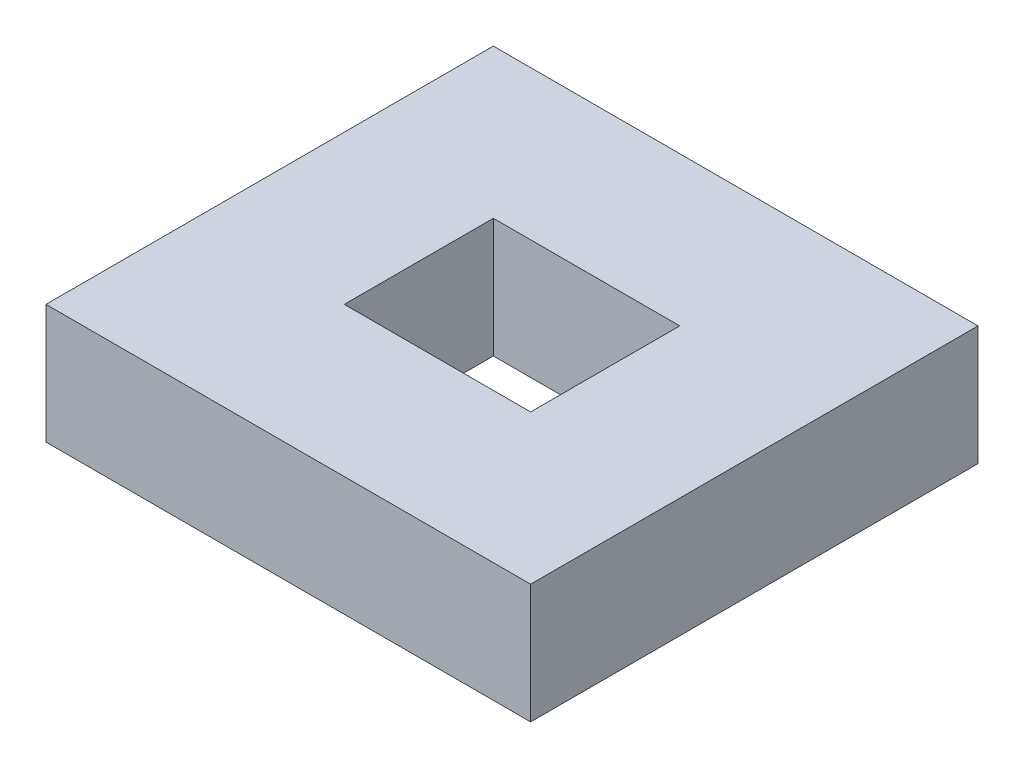
ISO-10303-21;
HEADER;
FILE_DESCRIPTION(('STEP AP214'),'2;1');
FILE_NAME('part.step','',(''),(''),'','','');
FILE_SCHEMA(('AUTOMOTIVE_DESIGN { 1 0 10303 214 1 1 1 1 }'));
ENDSEC;
DATA;
#1=APPLICATION_CONTEXT('core data for automotive mechanical design processes');
#2=APPLICATION_PROTOCOL_DEFINITION('international standard','automotive_design',2000,#1);
#3=PRODUCT_CONTEXT('',#1,'mechanical');
#4=PRODUCT('Part','Part','',(#3));
#5=PRODUCT_RELATED_PRODUCT_CATEGORY('part','',(#4));
#6=PRODUCT_DEFINITION_FORMATION('','',#4);
#7=PRODUCT_DEFINITION_CONTEXT('part definition',#1,'design');
#8=PRODUCT_DEFINITION('design','',#6,#7);
#9=PRODUCT_DEFINITION_SHAPE('','',#8);
#10=(LENGTH_UNIT() NAMED_UNIT(*) SI_UNIT(.MILLI.,.METRE.));
#11=(NAMED_UNIT(*) PLANE_ANGLE_UNIT() SI_UNIT($,.RADIAN.));
#12=(NAMED_UNIT(*) SI_UNIT($,.STERADIAN.) SOLID_ANGLE_UNIT());
#13=UNCERTAINTY_MEASURE_WITH_UNIT(LENGTH_MEASURE(1.E-05),#10,'distance_accuracy_value','');
#14=(GEOMETRIC_REPRESENTATION_CONTEXT(3) GLOBAL_UNCERTAINTY_ASSIGNED_CONTEXT((#13)) GLOBAL_UNIT_ASSIGNED_CONTEXT((#10,
#11,#12)) REPRESENTATION_CONTEXT('',''));
#15=CARTESIAN_POINT('',(0.,0.,0.));
#16=DIRECTION('',(0.,0.,1.));
#17=DIRECTION('',(1.,0.,0.));
#18=AXIS2_PLACEMENT_3D('',#15,#16,#17);
#19=CARTESIAN_POINT('',(0.,2.54,0.));
#20=DIRECTION('',(0.,-1.,0.));
#21=DIRECTION('',(0.,0.,-1.));
#22=AXIS2_PLACEMENT_3D('',#19,#20,#21);
#23=PLANE('',#22);
#24=DIRECTION('',(0.,0.,-1.));
#25=VECTOR('',#24,1.);
#26=CARTESIAN_POINT('',(5.159375,2.54,4.7625));
#27=LINE('',#26,#25);
#28=CARTESIAN_POINT('',(5.159375,2.54,4.7625));
#29=VERTEX_POINT('',#28);
#30=CARTESIAN_POINT('',(5.159375,2.54,-4.7625));
#31=VERTEX_POINT('',#30);
#32=EDGE_CURVE('E133',#29,#31,#27,.T.);
#33=ORIENTED_EDGE('',*,*,#32,.T.);
#34=DIRECTION('',(-1.,0.,0.));
#35=VECTOR('',#34,1.);
#36=CARTESIAN_POINT('',(-5.159375,2.54,-4.7625));
#37=LINE('',#36,#35);
#38=CARTESIAN_POINT('',(-5.159375,2.54,-4.7625));
#39=VERTEX_POINT('',#38);
#40=EDGE_CURVE('E136',#31,#39,#37,.T.);
#41=ORIENTED_EDGE('',*,*,#40,.T.);
#42=DIRECTION('',(0.,0.,1.));
#43=VECTOR('',#42,1.);
#44=CARTESIAN_POINT('',(-5.159375,2.54,4.7625));
#45=LINE('',#44,#43);
#46=CARTESIAN_POINT('',(-5.159375,2.54,4.7625));
#47=VERTEX_POINT('',#46);
#48=EDGE_CURVE('E139',#39,#47,#45,.T.);
#49=ORIENTED_EDGE('',*,*,#48,.T.);
#50=DIRECTION('',(1.,0.,0.));
#51=VECTOR('',#50,1.);
#52=CARTESIAN_POINT('',(-5.159375,2.54,4.7625));
#53=LINE('',#52,#51);
#54=EDGE_CURVE('E141',#47,#29,#53,.T.);
#55=ORIENTED_EDGE('',*,*,#54,.T.);
#56=EDGE_LOOP('',(#33,#41,#49,#55));
#57=FACE_BOUND('',#56,.T.);
#58=DIRECTION('',(0.,0.,-1.));
#59=VECTOR('',#58,1.);
#60=CARTESIAN_POINT('',(1.984375,2.54,1.5875));
#61=LINE('',#60,#59);
#62=CARTESIAN_POINT('',(1.984375,2.54,1.5875));
#63=VERTEX_POINT('',#62);
#64=CARTESIAN_POINT('',(1.984375,2.54,-1.5875));
#65=VERTEX_POINT('',#64);
#66=EDGE_CURVE('E97',#63,#65,#61,.T.);
#67=ORIENTED_EDGE('',*,*,#66,.F.);
#68=DIRECTION('',(1.,0.,0.));
#69=VECTOR('',#68,1.);
#70=CARTESIAN_POINT('',(-1.984375,2.54,1.5875));
#71=LINE('',#70,#69);
#72=CARTESIAN_POINT('',(-1.984375,2.54,1.5875));
#73=VERTEX_POINT('',#72);
#74=EDGE_CURVE('E119',#73,#63,#71,.T.);
#75=ORIENTED_EDGE('',*,*,#74,.F.);
#76=DIRECTION('',(0.,0.,1.));
#77=VECTOR('',#76,1.);
#78=CARTESIAN_POINT('',(-1.984375,2.54,1.5875));
#79=LINE('',#78,#77);
#80=CARTESIAN_POINT('',(-1.984375,2.54,-1.5875));
#81=VERTEX_POINT('',#80);
#82=EDGE_CURVE('E117',#81,#73,#79,.T.);
#83=ORIENTED_EDGE('',*,*,#82,.F.);
#84=DIRECTION('',(-1.,0.,0.));
#85=VECTOR('',#84,1.);
#86=CARTESIAN_POINT('',(-1.984375,2.54,-1.5875));
#87=LINE('',#86,#85);
#88=EDGE_CURVE('E105',#65,#81,#87,.T.);
#89=ORIENTED_EDGE('',*,*,#88,.F.);
#90=EDGE_LOOP('',(#67,#75,#83,#89));
#91=FACE_BOUND('',#90,.T.);
#92=ADVANCED_FACE('F32',(#57,#91),#23,.F.);
#93=CARTESIAN_POINT('',(0.,0.,0.));
#94=DIRECTION('',(0.,-1.,0.));
#95=DIRECTION('',(0.,0.,-1.));
#96=AXIS2_PLACEMENT_3D('',#93,#94,#95);
#97=PLANE('',#96);
#98=DIRECTION('',(0.,0.,-1.));
#99=VECTOR('',#98,1.);
#100=CARTESIAN_POINT('',(5.159375,0.,4.7625));
#101=LINE('',#100,#99);
#102=CARTESIAN_POINT('',(5.159375,0.,4.7625));
#103=VERTEX_POINT('',#102);
#104=CARTESIAN_POINT('',(5.159375,0.,-4.7625));
#105=VERTEX_POINT('',#104);
#106=EDGE_CURVE('E113',#103,#105,#101,.T.);
#107=ORIENTED_EDGE('',*,*,#106,.F.);
#108=DIRECTION('',(1.,0.,0.));
#109=VECTOR('',#108,1.);
#110=CARTESIAN_POINT('',(-5.159375,0.,4.7625));
#111=LINE('',#110,#109);
#112=CARTESIAN_POINT('',(-5.159375,0.,4.7625));
#113=VERTEX_POINT('',#112);
#114=EDGE_CURVE('E137',#113,#103,#111,.T.);
#115=ORIENTED_EDGE('',*,*,#114,.F.);
#116=DIRECTION('',(0.,0.,1.));
#117=VECTOR('',#116,1.);
#118=CARTESIAN_POINT('',(-5.159375,0.,4.7625));
#119=LINE('',#118,#117);
#120=CARTESIAN_POINT('',(-5.159375,0.,-4.7625));
#121=VERTEX_POINT('',#120);
#122=EDGE_CURVE('E148',#121,#113,#119,.T.);
#123=ORIENTED_EDGE('',*,*,#122,.F.);
#124=DIRECTION('',(-1.,0.,0.));
#125=VECTOR('',#124,1.);
#126=CARTESIAN_POINT('',(-5.159375,0.,-4.7625));
#127=LINE('',#126,#125);
#128=EDGE_CURVE('E146',#105,#121,#127,.T.);
#129=ORIENTED_EDGE('',*,*,#128,.F.);
#130=EDGE_LOOP('',(#107,#115,#123,#129));
#131=FACE_BOUND('',#130,.T.);
#132=DIRECTION('',(1.,0.,0.));
#133=VECTOR('',#132,1.);
#134=CARTESIAN_POINT('',(-1.984375,0.,1.5875));
#135=LINE('',#134,#133);
#136=CARTESIAN_POINT('',(-1.984375,0.,1.5875));
#137=VERTEX_POINT('',#136);
#138=CARTESIAN_POINT('',(1.984375,0.,1.5875));
#139=VERTEX_POINT('',#138);
#140=EDGE_CURVE('E106',#137,#139,#135,.T.);
#141=ORIENTED_EDGE('',*,*,#140,.T.);
#142=DIRECTION('',(0.,0.,-1.));
#143=VECTOR('',#142,1.);
#144=CARTESIAN_POINT('',(1.984375,0.,1.5875));
#145=LINE('',#144,#143);
#146=CARTESIAN_POINT('',(1.984375,0.,-1.5875));
#147=VERTEX_POINT('',#146);
#148=EDGE_CURVE('E55',#139,#147,#145,.T.);
#149=ORIENTED_EDGE('',*,*,#148,.T.);
#150=DIRECTION('',(-1.,0.,0.));
#151=VECTOR('',#150,1.);
#152=CARTESIAN_POINT('',(-1.984375,0.,-1.5875));
#153=LINE('',#152,#151);
#154=CARTESIAN_POINT('',(-1.984375,0.,-1.5875));
#155=VERTEX_POINT('',#154);
#156=EDGE_CURVE('E112',#147,#155,#153,.T.);
#157=ORIENTED_EDGE('',*,*,#156,.T.);
#158=DIRECTION('',(0.,0.,1.));
#159=VECTOR('',#158,1.);
#160=CARTESIAN_POINT('',(-1.984375,0.,1.5875));
#161=LINE('',#160,#159);
#162=EDGE_CURVE('E125',#155,#137,#161,.T.);
#163=ORIENTED_EDGE('',*,*,#162,.T.);
#164=EDGE_LOOP('',(#141,#149,#157,#163));
#165=FACE_BOUND('',#164,.T.);
#166=ADVANCED_FACE('F166',(#131,#165),#97,.T.);
#167=CARTESIAN_POINT('',(5.159375,2.54,4.7625));
#168=DIRECTION('',(-1.,0.,0.));
#169=DIRECTION('',(0.,0.,1.));
#170=AXIS2_PLACEMENT_3D('',#167,#168,#169);
#171=PLANE('',#170);
#172=ORIENTED_EDGE('',*,*,#106,.T.);
#173=DIRECTION('',(0.,-1.,0.));
#174=VECTOR('',#173,1.);
#175=CARTESIAN_POINT('',(5.159375,2.54,-4.7625));
#176=LINE('',#175,#174);
#177=EDGE_CURVE('E11',#31,#105,#176,.T.);
#178=ORIENTED_EDGE('',*,*,#177,.F.);
#179=ORIENTED_EDGE('',*,*,#32,.F.);
#180=DIRECTION('',(0.,-1.,0.));
#181=VECTOR('',#180,1.);
#182=CARTESIAN_POINT('',(5.159375,2.54,4.7625));
#183=LINE('',#182,#181);
#184=EDGE_CURVE('E143',#29,#103,#183,.T.);
#185=ORIENTED_EDGE('',*,*,#184,.T.);
#186=EDGE_LOOP('',(#172,#178,#179,#185));
#187=FACE_BOUND('',#186,.T.);
#188=ADVANCED_FACE('F34',(#187),#171,.F.);
#189=CARTESIAN_POINT('',(-5.159375,2.54,-4.7625));
#190=DIRECTION('',(0.,0.,1.));
#191=DIRECTION('',(1.,0.,0.));
#192=AXIS2_PLACEMENT_3D('',#189,#190,#191);
#193=PLANE('',#192);
#194=ORIENTED_EDGE('',*,*,#128,.T.);
#195=DIRECTION('',(0.,-1.,0.));
#196=VECTOR('',#195,1.);
#197=CARTESIAN_POINT('',(-5.159375,2.54,-4.7625));
#198=LINE('',#197,#196);
#199=EDGE_CURVE('E40',#39,#121,#198,.T.);
#200=ORIENTED_EDGE('',*,*,#199,.F.);
#201=ORIENTED_EDGE('',*,*,#40,.F.);
#202=ORIENTED_EDGE('',*,*,#177,.T.);
#203=EDGE_LOOP('',(#194,#200,#201,#202));
#204=FACE_BOUND('',#203,.T.);
#205=ADVANCED_FACE('F176',(#204),#193,.F.);
#206=CARTESIAN_POINT('',(-5.159375,2.54,4.7625));
#207=DIRECTION('',(1.,0.,0.));
#208=DIRECTION('',(0.,0.,-1.));
#209=AXIS2_PLACEMENT_3D('',#206,#207,#208);
#210=PLANE('',#209);
#211=ORIENTED_EDGE('',*,*,#122,.T.);
#212=DIRECTION('',(0.,-1.,0.));
#213=VECTOR('',#212,1.);
#214=CARTESIAN_POINT('',(-5.159375,2.54,4.7625));
#215=LINE('',#214,#213);
#216=EDGE_CURVE('E153',#47,#113,#215,.T.);
#217=ORIENTED_EDGE('',*,*,#216,.F.);
#218=ORIENTED_EDGE('',*,*,#48,.F.);
#219=ORIENTED_EDGE('',*,*,#199,.T.);
#220=EDGE_LOOP('',(#211,#217,#218,#219));
#221=FACE_BOUND('',#220,.T.);
#222=ADVANCED_FACE('F160',(#221),#210,.F.);
#223=CARTESIAN_POINT('',(-5.159375,2.54,4.7625));
#224=DIRECTION('',(0.,0.,-1.));
#225=DIRECTION('',(-1.,0.,0.));
#226=AXIS2_PLACEMENT_3D('',#223,#224,#225);
#227=PLANE('',#226);
#228=ORIENTED_EDGE('',*,*,#114,.T.);
#229=ORIENTED_EDGE('',*,*,#184,.F.);
#230=ORIENTED_EDGE('',*,*,#54,.F.);
#231=ORIENTED_EDGE('',*,*,#216,.T.);
#232=EDGE_LOOP('',(#228,#229,#230,#231));
#233=FACE_BOUND('',#232,.T.);
#234=ADVANCED_FACE('F170',(#233),#227,.F.);
#235=CARTESIAN_POINT('',(1.984375,2.54,1.5875));
#236=DIRECTION('',(-1.,0.,0.));
#237=DIRECTION('',(0.,0.,1.));
#238=AXIS2_PLACEMENT_3D('',#235,#236,#237);
#239=PLANE('',#238);
#240=ORIENTED_EDGE('',*,*,#148,.F.);
#241=DIRECTION('',(0.,-1.,0.));
#242=VECTOR('',#241,1.);
#243=CARTESIAN_POINT('',(1.984375,2.54,1.5875));
#244=LINE('',#243,#242);
#245=EDGE_CURVE('E101',#63,#139,#244,.T.);
#246=ORIENTED_EDGE('',*,*,#245,.F.);
#247=ORIENTED_EDGE('',*,*,#66,.T.);
#248=DIRECTION('',(0.,-1.,0.));
#249=VECTOR('',#248,1.);
#250=CARTESIAN_POINT('',(1.984375,2.54,-1.5875));
#251=LINE('',#250,#249);
#252=EDGE_CURVE('E100',#65,#147,#251,.T.);
#253=ORIENTED_EDGE('',*,*,#252,.T.);
#254=EDGE_LOOP('',(#240,#246,#247,#253));
#255=FACE_BOUND('',#254,.T.);
#256=ADVANCED_FACE('F99',(#255),#239,.T.);
#257=CARTESIAN_POINT('',(-1.984375,2.54,-1.5875));
#258=DIRECTION('',(0.,0.,1.));
#259=DIRECTION('',(1.,0.,0.));
#260=AXIS2_PLACEMENT_3D('',#257,#258,#259);
#261=PLANE('',#260);
#262=ORIENTED_EDGE('',*,*,#156,.F.);
#263=ORIENTED_EDGE('',*,*,#252,.F.);
#264=ORIENTED_EDGE('',*,*,#88,.T.);
#265=DIRECTION('',(0.,-1.,0.));
#266=VECTOR('',#265,1.);
#267=CARTESIAN_POINT('',(-1.984375,2.54,-1.5875));
#268=LINE('',#267,#266);
#269=EDGE_CURVE('E114',#81,#155,#268,.T.);
#270=ORIENTED_EDGE('',*,*,#269,.T.);
#271=EDGE_LOOP('',(#262,#263,#264,#270));
#272=FACE_BOUND('',#271,.T.);
#273=ADVANCED_FACE('F109',(#272),#261,.T.);
#274=CARTESIAN_POINT('',(-1.984375,2.54,1.5875));
#275=DIRECTION('',(1.,0.,0.));
#276=DIRECTION('',(0.,0.,-1.));
#277=AXIS2_PLACEMENT_3D('',#274,#275,#276);
#278=PLANE('',#277);
#279=ORIENTED_EDGE('',*,*,#162,.F.);
#280=ORIENTED_EDGE('',*,*,#269,.F.);
#281=ORIENTED_EDGE('',*,*,#82,.T.);
#282=DIRECTION('',(0.,-1.,0.));
#283=VECTOR('',#282,1.);
#284=CARTESIAN_POINT('',(-1.984375,2.54,1.5875));
#285=LINE('',#284,#283);
#286=EDGE_CURVE('E47',#73,#137,#285,.T.);
#287=ORIENTED_EDGE('',*,*,#286,.T.);
#288=EDGE_LOOP('',(#279,#280,#281,#287));
#289=FACE_BOUND('',#288,.T.);
#290=ADVANCED_FACE('F199',(#289),#278,.T.);
#291=CARTESIAN_POINT('',(-1.984375,2.54,1.5875));
#292=DIRECTION('',(0.,0.,-1.));
#293=DIRECTION('',(-1.,0.,0.));
#294=AXIS2_PLACEMENT_3D('',#291,#292,#293);
#295=PLANE('',#294);
#296=ORIENTED_EDGE('',*,*,#140,.F.);
#297=ORIENTED_EDGE('',*,*,#286,.F.);
#298=ORIENTED_EDGE('',*,*,#74,.T.);
#299=ORIENTED_EDGE('',*,*,#245,.T.);
#300=EDGE_LOOP('',(#296,#297,#298,#299));
#301=FACE_BOUND('',#300,.T.);
#302=ADVANCED_FACE('F203',(#301),#295,.T.);
#303=CLOSED_SHELL('',(#92,#166,#188,#205,#222,#234,#256,#273,#290,#302));
#304=MANIFOLD_SOLID_BREP('B2',#303);
#305=ADVANCED_BREP_SHAPE_REPRESENTATION('',(#18,#304),#14);
#306=SHAPE_DEFINITION_REPRESENTATION(#9,#305);
ENDSEC;
END-ISO-10303-21;
